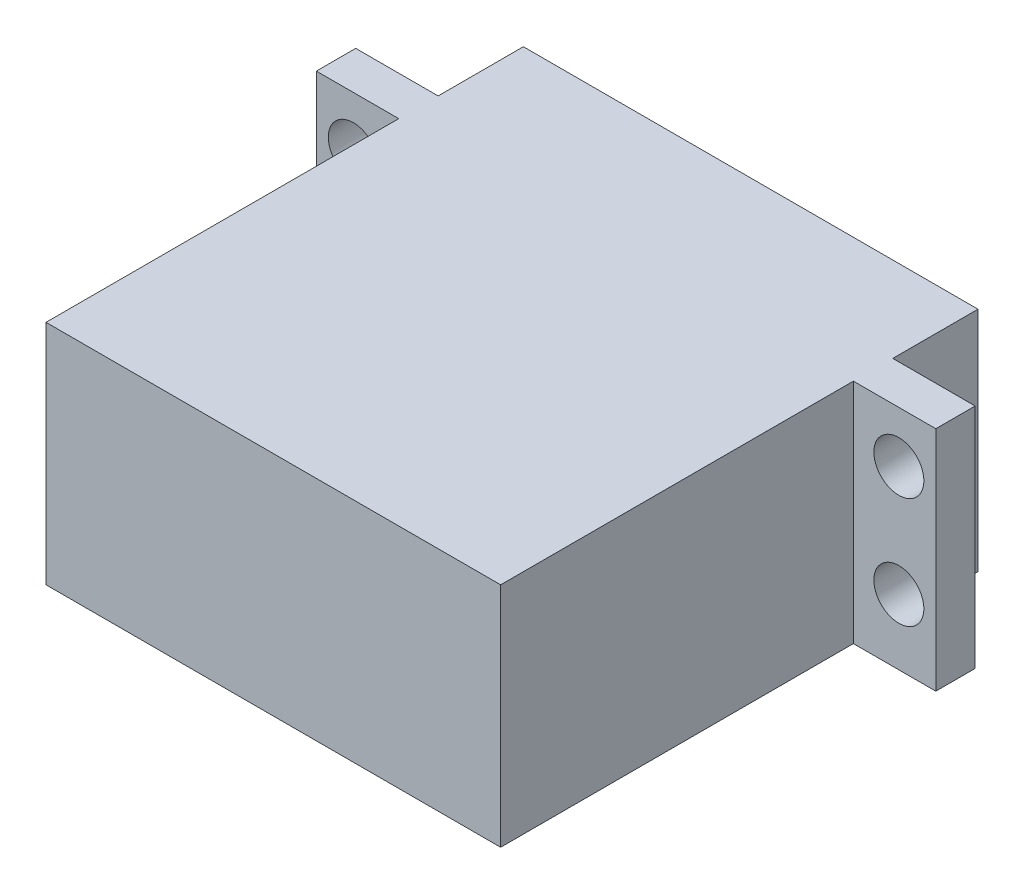
ISO-10303-21;
HEADER;
FILE_DESCRIPTION(('STEP AP214'),'2;1');
FILE_NAME('part.step','',(''),(''),'','','');
FILE_SCHEMA(('AUTOMOTIVE_DESIGN { 1 0 10303 214 1 1 1 1 }'));
ENDSEC;
DATA;
#1=APPLICATION_CONTEXT('core data for automotive mechanical design processes');
#2=APPLICATION_PROTOCOL_DEFINITION('international standard','automotive_design',2000,#1);
#3=PRODUCT_CONTEXT('',#1,'mechanical');
#4=PRODUCT('Part','Part','',(#3));
#5=PRODUCT_RELATED_PRODUCT_CATEGORY('part','',(#4));
#6=PRODUCT_DEFINITION_FORMATION('','',#4);
#7=PRODUCT_DEFINITION_CONTEXT('part definition',#1,'design');
#8=PRODUCT_DEFINITION('design','',#6,#7);
#9=PRODUCT_DEFINITION_SHAPE('','',#8);
#10=(LENGTH_UNIT() NAMED_UNIT(*) SI_UNIT(.MILLI.,.METRE.));
#11=(NAMED_UNIT(*) PLANE_ANGLE_UNIT() SI_UNIT($,.RADIAN.));
#12=(NAMED_UNIT(*) SI_UNIT($,.STERADIAN.) SOLID_ANGLE_UNIT());
#13=UNCERTAINTY_MEASURE_WITH_UNIT(LENGTH_MEASURE(1.E-05),#10,'distance_accuracy_value','');
#14=(GEOMETRIC_REPRESENTATION_CONTEXT(3) GLOBAL_UNCERTAINTY_ASSIGNED_CONTEXT((#13)) GLOBAL_UNIT_ASSIGNED_CONTEXT((#10,
#11,#12)) REPRESENTATION_CONTEXT('',''));
#15=CARTESIAN_POINT('',(0.,0.,0.));
#16=DIRECTION('',(0.,0.,1.));
#17=DIRECTION('',(1.,0.,0.));
#18=AXIS2_PLACEMENT_3D('',#15,#16,#17);
#19=CARTESIAN_POINT('',(-20.,20.,-21.));
#20=DIRECTION('',(1.,0.,0.));
#21=DIRECTION('',(0.,0.,-1.));
#22=AXIS2_PLACEMENT_3D('',#19,#20,#21);
#23=PLANE('',#22);
#24=DIRECTION('',(0.,0.,1.));
#25=VECTOR('',#24,1.);
#26=CARTESIAN_POINT('',(-20.,20.,-21.));
#27=LINE('',#26,#25);
#28=CARTESIAN_POINT('',(-20.,20.,-10.0367099661439));
#29=VERTEX_POINT('',#28);
#30=CARTESIAN_POINT('',(-20.,20.,21.));
#31=VERTEX_POINT('',#30);
#32=EDGE_CURVE('E207',#29,#31,#27,.T.);
#33=ORIENTED_EDGE('',*,*,#32,.F.);
#34=DIRECTION('',(0.,-1.,0.));
#35=VECTOR('',#34,1.);
#36=CARTESIAN_POINT('',(-20.,20.,-10.0367099661439));
#37=LINE('',#36,#35);
#38=CARTESIAN_POINT('',(-20.,0.,-10.0367099661439));
#39=VERTEX_POINT('',#38);
#40=EDGE_CURVE('E134',#29,#39,#37,.T.);
#41=ORIENTED_EDGE('',*,*,#40,.T.);
#42=DIRECTION('',(0.,0.,1.));
#43=VECTOR('',#42,1.);
#44=CARTESIAN_POINT('',(-20.,0.,-21.));
#45=LINE('',#44,#43);
#46=CARTESIAN_POINT('',(-20.,0.,21.));
#47=VERTEX_POINT('',#46);
#48=EDGE_CURVE('E217',#39,#47,#45,.T.);
#49=ORIENTED_EDGE('',*,*,#48,.T.);
#50=DIRECTION('',(0.,-1.,0.));
#51=VECTOR('',#50,1.);
#52=CARTESIAN_POINT('',(-20.,20.,21.));
#53=LINE('',#52,#51);
#54=EDGE_CURVE('E225',#31,#47,#53,.T.);
#55=ORIENTED_EDGE('',*,*,#54,.F.);
#56=EDGE_LOOP('',(#33,#41,#49,#55));
#57=FACE_BOUND('',#56,.T.);
#58=ADVANCED_FACE('F37',(#57),#23,.F.);
#59=CARTESIAN_POINT('',(20.,20.,-21.));
#60=DIRECTION('',(-1.,0.,0.));
#61=DIRECTION('',(0.,0.,1.));
#62=AXIS2_PLACEMENT_3D('',#59,#60,#61);
#63=PLANE('',#62);
#64=DIRECTION('',(0.,-1.,0.));
#65=VECTOR('',#64,1.);
#66=CARTESIAN_POINT('',(20.,20.,-10.0367099661439));
#67=LINE('',#66,#65);
#68=CARTESIAN_POINT('',(20.,20.,-10.0367099661439));
#69=VERTEX_POINT('',#68);
#70=CARTESIAN_POINT('',(20.,0.,-10.0367099661439));
#71=VERTEX_POINT('',#70);
#72=EDGE_CURVE('E60',#69,#71,#67,.T.);
#73=ORIENTED_EDGE('',*,*,#72,.F.);
#74=DIRECTION('',(0.,0.,-1.));
#75=VECTOR('',#74,1.);
#76=CARTESIAN_POINT('',(20.,20.,-21.));
#77=LINE('',#76,#75);
#78=CARTESIAN_POINT('',(20.,20.,21.));
#79=VERTEX_POINT('',#78);
#80=EDGE_CURVE('E202',#79,#69,#77,.T.);
#81=ORIENTED_EDGE('',*,*,#80,.F.);
#82=DIRECTION('',(0.,-1.,0.));
#83=VECTOR('',#82,1.);
#84=CARTESIAN_POINT('',(20.,20.,21.));
#85=LINE('',#84,#83);
#86=CARTESIAN_POINT('',(20.,0.,21.));
#87=VERTEX_POINT('',#86);
#88=EDGE_CURVE('E212',#79,#87,#85,.T.);
#89=ORIENTED_EDGE('',*,*,#88,.T.);
#90=DIRECTION('',(0.,0.,-1.));
#91=VECTOR('',#90,1.);
#92=CARTESIAN_POINT('',(20.,0.,-21.));
#93=LINE('',#92,#91);
#94=EDGE_CURVE('E213',#87,#71,#93,.T.);
#95=ORIENTED_EDGE('',*,*,#94,.T.);
#96=EDGE_LOOP('',(#73,#81,#89,#95));
#97=FACE_BOUND('',#96,.T.);
#98=ADVANCED_FACE('F39',(#97),#63,.F.);
#99=DIRECTION('',(0.,1.,0.));
#100=VECTOR('',#99,1.);
#101=CARTESIAN_POINT('',(20.,20.,-13.5));
#102=LINE('',#101,#100);
#103=CARTESIAN_POINT('',(20.,0.,-13.5));
#104=VERTEX_POINT('',#103);
#105=CARTESIAN_POINT('',(20.,20.,-13.5));
#106=VERTEX_POINT('',#105);
#107=EDGE_CURVE('E180',#104,#106,#102,.T.);
#108=ORIENTED_EDGE('',*,*,#107,.F.);
#109=CARTESIAN_POINT('',(20.,0.,-21.));
#110=VERTEX_POINT('',#109);
#111=EDGE_CURVE('E201',#104,#110,#93,.T.);
#112=ORIENTED_EDGE('',*,*,#111,.T.);
#113=DIRECTION('',(0.,-1.,0.));
#114=VECTOR('',#113,1.);
#115=CARTESIAN_POINT('',(20.,20.,-21.));
#116=LINE('',#115,#114);
#117=CARTESIAN_POINT('',(20.,20.,-21.));
#118=VERTEX_POINT('',#117);
#119=EDGE_CURVE('E45',#118,#110,#116,.T.);
#120=ORIENTED_EDGE('',*,*,#119,.F.);
#121=EDGE_CURVE('E205',#106,#118,#77,.T.);
#122=ORIENTED_EDGE('',*,*,#121,.F.);
#123=EDGE_LOOP('',(#108,#112,#120,#122));
#124=FACE_BOUND('',#123,.T.);
#125=ADVANCED_FACE('F238',(#124),#63,.F.);
#126=CARTESIAN_POINT('',(-20.,20.,-21.));
#127=DIRECTION('',(0.,0.,1.));
#128=DIRECTION('',(1.,0.,0.));
#129=AXIS2_PLACEMENT_3D('',#126,#127,#128);
#130=PLANE('',#129);
#131=CARTESIAN_POINT('',(-10.,10.,-21.));
#132=DIRECTION('',(0.,0.,1.));
#133=DIRECTION('',(1.,0.,0.));
#134=AXIS2_PLACEMENT_3D('',#131,#132,#133);
#135=CIRCLE('',#134,3.);
#136=CARTESIAN_POINT('',(-7.,10.,-21.));
#137=VERTEX_POINT('',#136);
#138=EDGE_CURVE('E11',#137,#137,#135,.F.);
#139=ORIENTED_EDGE('',*,*,#138,.F.);
#140=EDGE_LOOP('',(#139));
#141=FACE_BOUND('',#140,.T.);
#142=DIRECTION('',(-1.,0.,0.));
#143=VECTOR('',#142,1.);
#144=CARTESIAN_POINT('',(-20.,0.,-21.));
#145=LINE('',#144,#143);
#146=CARTESIAN_POINT('',(-20.,0.,-21.));
#147=VERTEX_POINT('',#146);
#148=EDGE_CURVE('E215',#110,#147,#145,.T.);
#149=ORIENTED_EDGE('',*,*,#148,.T.);
#150=DIRECTION('',(0.,-1.,0.));
#151=VECTOR('',#150,1.);
#152=CARTESIAN_POINT('',(-20.,20.,-21.));
#153=LINE('',#152,#151);
#154=CARTESIAN_POINT('',(-20.,20.,-21.));
#155=VERTEX_POINT('',#154);
#156=EDGE_CURVE('E228',#155,#147,#153,.T.);
#157=ORIENTED_EDGE('',*,*,#156,.F.);
#158=DIRECTION('',(-1.,0.,0.));
#159=VECTOR('',#158,1.);
#160=CARTESIAN_POINT('',(-20.,20.,-21.));
#161=LINE('',#160,#159);
#162=EDGE_CURVE('E204',#118,#155,#161,.T.);
#163=ORIENTED_EDGE('',*,*,#162,.F.);
#164=ORIENTED_EDGE('',*,*,#119,.T.);
#165=EDGE_LOOP('',(#149,#157,#163,#164));
#166=FACE_BOUND('',#165,.T.);
#167=ADVANCED_FACE('F234',(#141,#166),#130,.F.);
#168=CARTESIAN_POINT('',(-20.,0.,-13.5));
#169=VERTEX_POINT('',#168);
#170=EDGE_CURVE('E218',#147,#169,#45,.T.);
#171=ORIENTED_EDGE('',*,*,#170,.T.);
#172=DIRECTION('',(0.,1.,0.));
#173=VECTOR('',#172,1.);
#174=CARTESIAN_POINT('',(-20.,20.,-13.5));
#175=LINE('',#174,#173);
#176=CARTESIAN_POINT('',(-20.,20.,-13.5));
#177=VERTEX_POINT('',#176);
#178=EDGE_CURVE('E147',#169,#177,#175,.T.);
#179=ORIENTED_EDGE('',*,*,#178,.T.);
#180=EDGE_CURVE('E208',#155,#177,#27,.T.);
#181=ORIENTED_EDGE('',*,*,#180,.F.);
#182=ORIENTED_EDGE('',*,*,#156,.T.);
#183=EDGE_LOOP('',(#171,#179,#181,#182));
#184=FACE_BOUND('',#183,.T.);
#185=ADVANCED_FACE('F246',(#184),#23,.F.);
#186=CARTESIAN_POINT('',(-20.,20.,21.));
#187=DIRECTION('',(0.,0.,-1.));
#188=DIRECTION('',(-1.,0.,0.));
#189=AXIS2_PLACEMENT_3D('',#186,#187,#188);
#190=PLANE('',#189);
#191=DIRECTION('',(1.,0.,0.));
#192=VECTOR('',#191,1.);
#193=CARTESIAN_POINT('',(-20.,0.,21.));
#194=LINE('',#193,#192);
#195=EDGE_CURVE('E221',#47,#87,#194,.T.);
#196=ORIENTED_EDGE('',*,*,#195,.T.);
#197=ORIENTED_EDGE('',*,*,#88,.F.);
#198=DIRECTION('',(1.,0.,0.));
#199=VECTOR('',#198,1.);
#200=CARTESIAN_POINT('',(-20.,20.,21.));
#201=LINE('',#200,#199);
#202=EDGE_CURVE('E210',#31,#79,#201,.T.);
#203=ORIENTED_EDGE('',*,*,#202,.F.);
#204=ORIENTED_EDGE('',*,*,#54,.T.);
#205=EDGE_LOOP('',(#196,#197,#203,#204));
#206=FACE_BOUND('',#205,.T.);
#207=ADVANCED_FACE('F265',(#206),#190,.F.);
#208=CARTESIAN_POINT('',(0.,20.,0.));
#209=DIRECTION('',(0.,1.,0.));
#210=DIRECTION('',(0.,0.,1.));
#211=AXIS2_PLACEMENT_3D('',#208,#209,#210);
#212=PLANE('',#211);
#213=ORIENTED_EDGE('',*,*,#80,.T.);
#214=DIRECTION('',(-1.,0.,0.));
#215=VECTOR('',#214,1.);
#216=CARTESIAN_POINT('',(27.25,20.,-10.0367099661439));
#217=LINE('',#216,#215);
#218=CARTESIAN_POINT('',(27.25,20.,-10.0367099661439));
#219=VERTEX_POINT('',#218);
#220=EDGE_CURVE('E186',#219,#69,#217,.T.);
#221=ORIENTED_EDGE('',*,*,#220,.F.);
#222=DIRECTION('',(0.,0.,1.));
#223=VECTOR('',#222,1.);
#224=CARTESIAN_POINT('',(27.25,20.,-10.0367099661439));
#225=LINE('',#224,#223);
#226=CARTESIAN_POINT('',(27.25,20.,-13.5));
#227=VERTEX_POINT('',#226);
#228=EDGE_CURVE('E184',#227,#219,#225,.T.);
#229=ORIENTED_EDGE('',*,*,#228,.F.);
#230=DIRECTION('',(-1.,0.,0.));
#231=VECTOR('',#230,1.);
#232=CARTESIAN_POINT('',(27.25,20.,-13.5));
#233=LINE('',#232,#231);
#234=EDGE_CURVE('E192',#227,#106,#233,.T.);
#235=ORIENTED_EDGE('',*,*,#234,.T.);
#236=ORIENTED_EDGE('',*,*,#121,.T.);
#237=ORIENTED_EDGE('',*,*,#162,.T.);
#238=ORIENTED_EDGE('',*,*,#180,.T.);
#239=DIRECTION('',(1.,0.,0.));
#240=VECTOR('',#239,1.);
#241=CARTESIAN_POINT('',(-27.25,20.,-13.5));
#242=LINE('',#241,#240);
#243=CARTESIAN_POINT('',(-27.25,20.,-13.5));
#244=VERTEX_POINT('',#243);
#245=EDGE_CURVE('E52',#244,#177,#242,.T.);
#246=ORIENTED_EDGE('',*,*,#245,.F.);
#247=DIRECTION('',(0.,0.,1.));
#248=VECTOR('',#247,1.);
#249=CARTESIAN_POINT('',(-27.25,20.,-10.0367099661439));
#250=LINE('',#249,#248);
#251=CARTESIAN_POINT('',(-27.25,20.,-10.0367099661439));
#252=VERTEX_POINT('',#251);
#253=EDGE_CURVE('E144',#244,#252,#250,.T.);
#254=ORIENTED_EDGE('',*,*,#253,.T.);
#255=DIRECTION('',(1.,0.,0.));
#256=VECTOR('',#255,1.);
#257=CARTESIAN_POINT('',(-27.25,20.,-10.0367099661439));
#258=LINE('',#257,#256);
#259=EDGE_CURVE('E128',#252,#29,#258,.T.);
#260=ORIENTED_EDGE('',*,*,#259,.T.);
#261=ORIENTED_EDGE('',*,*,#32,.T.);
#262=ORIENTED_EDGE('',*,*,#202,.T.);
#263=EDGE_LOOP('',(#213,#221,#229,#235,#236,#237,#238,#246,#254,#260,#261,#262));
#264=FACE_BOUND('',#263,.T.);
#265=ADVANCED_FACE('F149',(#264),#212,.T.);
#266=CARTESIAN_POINT('',(0.,0.,0.));
#267=DIRECTION('',(0.,1.,0.));
#268=DIRECTION('',(0.,0.,1.));
#269=AXIS2_PLACEMENT_3D('',#266,#267,#268);
#270=PLANE('',#269);
#271=ORIENTED_EDGE('',*,*,#94,.F.);
#272=ORIENTED_EDGE('',*,*,#195,.F.);
#273=ORIENTED_EDGE('',*,*,#48,.F.);
#274=DIRECTION('',(1.,0.,0.));
#275=VECTOR('',#274,1.);
#276=CARTESIAN_POINT('',(-27.25,0.,-10.0367099661439));
#277=LINE('',#276,#275);
#278=CARTESIAN_POINT('',(-27.25,0.,-10.0367099661439));
#279=VERTEX_POINT('',#278);
#280=EDGE_CURVE('E157',#279,#39,#277,.T.);
#281=ORIENTED_EDGE('',*,*,#280,.F.);
#282=DIRECTION('',(0.,0.,-1.));
#283=VECTOR('',#282,1.);
#284=CARTESIAN_POINT('',(-27.25,0.,-10.0367099661439));
#285=LINE('',#284,#283);
#286=CARTESIAN_POINT('',(-27.25,0.,-13.5));
#287=VERTEX_POINT('',#286);
#288=EDGE_CURVE('E146',#279,#287,#285,.T.);
#289=ORIENTED_EDGE('',*,*,#288,.T.);
#290=DIRECTION('',(1.,0.,0.));
#291=VECTOR('',#290,1.);
#292=CARTESIAN_POINT('',(-27.25,0.,-13.5));
#293=LINE('',#292,#291);
#294=EDGE_CURVE('E162',#287,#169,#293,.T.);
#295=ORIENTED_EDGE('',*,*,#294,.T.);
#296=ORIENTED_EDGE('',*,*,#170,.F.);
#297=ORIENTED_EDGE('',*,*,#148,.F.);
#298=ORIENTED_EDGE('',*,*,#111,.F.);
#299=DIRECTION('',(-1.,0.,0.));
#300=VECTOR('',#299,1.);
#301=CARTESIAN_POINT('',(27.25,0.,-13.5));
#302=LINE('',#301,#300);
#303=CARTESIAN_POINT('',(27.25,0.,-13.5));
#304=VERTEX_POINT('',#303);
#305=EDGE_CURVE('E195',#304,#104,#302,.T.);
#306=ORIENTED_EDGE('',*,*,#305,.F.);
#307=DIRECTION('',(0.,0.,-1.));
#308=VECTOR('',#307,1.);
#309=CARTESIAN_POINT('',(27.25,0.,-10.0367099661439));
#310=LINE('',#309,#308);
#311=CARTESIAN_POINT('',(27.25,0.,-10.0367099661439));
#312=VERTEX_POINT('',#311);
#313=EDGE_CURVE('E179',#312,#304,#310,.T.);
#314=ORIENTED_EDGE('',*,*,#313,.F.);
#315=DIRECTION('',(-1.,0.,0.));
#316=VECTOR('',#315,1.);
#317=CARTESIAN_POINT('',(27.25,0.,-10.0367099661439));
#318=LINE('',#317,#316);
#319=EDGE_CURVE('E198',#312,#71,#318,.T.);
#320=ORIENTED_EDGE('',*,*,#319,.T.);
#321=EDGE_LOOP('',(#271,#272,#273,#281,#289,#295,#296,#297,#298,#306,#314,#320));
#322=FACE_BOUND('',#321,.T.);
#323=ADVANCED_FACE('F244',(#322),#270,.F.);
#324=CARTESIAN_POINT('',(27.25,20.,-10.0367099661439));
#325=DIRECTION('',(0.,0.,-1.));
#326=DIRECTION('',(0.,1.,0.));
#327=AXIS2_PLACEMENT_3D('',#324,#325,#326);
#328=PLANE('',#327);
#329=CARTESIAN_POINT('',(24.,15.5,-10.0367099661439));
#330=DIRECTION('',(0.,0.,-1.));
#331=DIRECTION('',(0.,1.,0.));
#332=AXIS2_PLACEMENT_3D('',#329,#330,#331);
#333=CIRCLE('',#332,2.2);
#334=CARTESIAN_POINT('',(21.8,15.5,-10.0367099661439));
#335=VERTEX_POINT('',#334);
#336=EDGE_CURVE('E173',#335,#335,#333,.T.);
#337=ORIENTED_EDGE('',*,*,#336,.T.);
#338=EDGE_LOOP('',(#337));
#339=FACE_BOUND('',#338,.T.);
#340=CARTESIAN_POINT('',(24.,5.75,-10.0367099661439));
#341=DIRECTION('',(0.,0.,-1.));
#342=DIRECTION('',(0.,1.,0.));
#343=AXIS2_PLACEMENT_3D('',#340,#341,#342);
#344=CIRCLE('',#343,2.2);
#345=CARTESIAN_POINT('',(21.8,5.75,-10.0367099661439));
#346=VERTEX_POINT('',#345);
#347=EDGE_CURVE('E168',#346,#346,#344,.T.);
#348=ORIENTED_EDGE('',*,*,#347,.T.);
#349=EDGE_LOOP('',(#348));
#350=FACE_BOUND('',#349,.T.);
#351=ORIENTED_EDGE('',*,*,#72,.T.);
#352=ORIENTED_EDGE('',*,*,#319,.F.);
#353=DIRECTION('',(0.,-1.,0.));
#354=VECTOR('',#353,1.);
#355=CARTESIAN_POINT('',(27.25,20.,-10.0367099661439));
#356=LINE('',#355,#354);
#357=EDGE_CURVE('E176',#219,#312,#356,.T.);
#358=ORIENTED_EDGE('',*,*,#357,.F.);
#359=ORIENTED_EDGE('',*,*,#220,.T.);
#360=EDGE_LOOP('',(#351,#352,#358,#359));
#361=FACE_BOUND('',#360,.T.);
#362=ADVANCED_FACE('F259',(#339,#350,#361),#328,.F.);
#363=CARTESIAN_POINT('',(27.25,20.,-13.5));
#364=DIRECTION('',(0.,0.,1.));
#365=DIRECTION('',(1.,0.,0.));
#366=AXIS2_PLACEMENT_3D('',#363,#364,#365);
#367=PLANE('',#366);
#368=CARTESIAN_POINT('',(24.,15.5,-13.5));
#369=DIRECTION('',(0.,0.,-1.));
#370=DIRECTION('',(-1.,0.,0.));
#371=AXIS2_PLACEMENT_3D('',#368,#369,#370);
#372=CIRCLE('',#371,2.2);
#373=CARTESIAN_POINT('',(21.8,15.5,-13.5));
#374=VERTEX_POINT('',#373);
#375=EDGE_CURVE('E165',#374,#374,#372,.T.);
#376=ORIENTED_EDGE('',*,*,#375,.F.);
#377=EDGE_LOOP('',(#376));
#378=FACE_BOUND('',#377,.T.);
#379=CARTESIAN_POINT('',(24.,5.75,-13.5));
#380=DIRECTION('',(0.,0.,-1.));
#381=DIRECTION('',(-1.,0.,0.));
#382=AXIS2_PLACEMENT_3D('',#379,#380,#381);
#383=CIRCLE('',#382,2.2);
#384=CARTESIAN_POINT('',(21.8,5.75,-13.5));
#385=VERTEX_POINT('',#384);
#386=EDGE_CURVE('E138',#385,#385,#383,.T.);
#387=ORIENTED_EDGE('',*,*,#386,.F.);
#388=EDGE_LOOP('',(#387));
#389=FACE_BOUND('',#388,.T.);
#390=ORIENTED_EDGE('',*,*,#107,.T.);
#391=ORIENTED_EDGE('',*,*,#234,.F.);
#392=DIRECTION('',(0.,1.,0.));
#393=VECTOR('',#392,1.);
#394=CARTESIAN_POINT('',(27.25,20.,-13.5));
#395=LINE('',#394,#393);
#396=EDGE_CURVE('E182',#304,#227,#395,.T.);
#397=ORIENTED_EDGE('',*,*,#396,.F.);
#398=ORIENTED_EDGE('',*,*,#305,.T.);
#399=EDGE_LOOP('',(#390,#391,#397,#398));
#400=FACE_BOUND('',#399,.T.);
#401=ADVANCED_FACE('F253',(#378,#389,#400),#367,.F.);
#402=CARTESIAN_POINT('',(27.25,0.,0.));
#403=DIRECTION('',(1.,0.,0.));
#404=DIRECTION('',(0.,0.,-1.));
#405=AXIS2_PLACEMENT_3D('',#402,#403,#404);
#406=PLANE('',#405);
#407=ORIENTED_EDGE('',*,*,#357,.T.);
#408=ORIENTED_EDGE('',*,*,#313,.T.);
#409=ORIENTED_EDGE('',*,*,#396,.T.);
#410=ORIENTED_EDGE('',*,*,#228,.T.);
#411=EDGE_LOOP('',(#407,#408,#409,#410));
#412=FACE_BOUND('',#411,.T.);
#413=ADVANCED_FACE('F257',(#412),#406,.T.);
#414=CARTESIAN_POINT('',(24.,5.75,-6.25));
#415=DIRECTION('',(0.,0.,-1.));
#416=DIRECTION('',(-1.,0.,0.));
#417=AXIS2_PLACEMENT_3D('',#414,#415,#416);
#418=CYLINDRICAL_SURFACE('',#417,2.2);
#419=CARTESIAN_POINT('',(21.8,5.75,-13.5));
#420=CARTESIAN_POINT('',(21.8,5.75,-13.4639240621473));
#421=CARTESIAN_POINT('',(21.8,5.75,-13.4278481242947));
#422=CARTESIAN_POINT('',(21.8,5.75,-13.3556962485893));
#423=CARTESIAN_POINT('',(21.8,5.75,-13.3196203107367));
#424=CARTESIAN_POINT('',(21.8,5.75,-13.2474684350313));
#425=CARTESIAN_POINT('',(21.8,5.75,-13.2113924971787));
#426=CARTESIAN_POINT('',(21.8,5.75,-13.1392406214733));
#427=CARTESIAN_POINT('',(21.8,5.75,-13.1031646836207));
#428=CARTESIAN_POINT('',(21.8,5.75,-13.0310128079153));
#429=CARTESIAN_POINT('',(21.8,5.75,-12.9949368700627));
#430=CARTESIAN_POINT('',(21.8,5.75,-12.9227849943573));
#431=CARTESIAN_POINT('',(21.8,5.75,-12.8867090565047));
#432=CARTESIAN_POINT('',(21.8,5.75,-12.8145571807993));
#433=CARTESIAN_POINT('',(21.8,5.75,-12.7784812429467));
#434=CARTESIAN_POINT('',(21.8,5.75,-12.7063293672413));
#435=CARTESIAN_POINT('',(21.8,5.75,-12.6702534293887));
#436=CARTESIAN_POINT('',(21.8,5.75,-12.5981015536833));
#437=CARTESIAN_POINT('',(21.8,5.75,-12.5620256158306));
#438=CARTESIAN_POINT('',(21.8,5.75,-12.4898737401253));
#439=CARTESIAN_POINT('',(21.8,5.75,-12.4537978022726));
#440=CARTESIAN_POINT('',(21.8,5.75,-12.3816459265673));
#441=CARTESIAN_POINT('',(21.8,5.75,-12.3455699887146));
#442=CARTESIAN_POINT('',(21.8,5.75,-12.2734181130093));
#443=CARTESIAN_POINT('',(21.8,5.75,-12.2373421751566));
#444=CARTESIAN_POINT('',(21.8,5.75,-12.1651902994513));
#445=CARTESIAN_POINT('',(21.8,5.75,-12.1291143615986));
#446=CARTESIAN_POINT('',(21.8,5.75,-12.0569624858933));
#447=CARTESIAN_POINT('',(21.8,5.75,-12.0208865480406));
#448=CARTESIAN_POINT('',(21.8,5.75,-11.9487346723353));
#449=CARTESIAN_POINT('',(21.8,5.75,-11.9126587344826));
#450=CARTESIAN_POINT('',(21.8,5.75,-11.8405068587773));
#451=CARTESIAN_POINT('',(21.8,5.75,-11.8044309209246));
#452=CARTESIAN_POINT('',(21.8,5.75,-11.7322790452193));
#453=CARTESIAN_POINT('',(21.8,5.75,-11.6962031073666));
#454=CARTESIAN_POINT('',(21.8,5.75,-11.6240512316613));
#455=CARTESIAN_POINT('',(21.8,5.75,-11.5879752938086));
#456=CARTESIAN_POINT('',(21.8,5.75,-11.5158234181033));
#457=CARTESIAN_POINT('',(21.8,5.75,-11.4797474802506));
#458=CARTESIAN_POINT('',(21.8,5.75,-11.4075956045453));
#459=CARTESIAN_POINT('',(21.8,5.75,-11.3715196666926));
#460=CARTESIAN_POINT('',(21.8,5.75,-11.2993677909873));
#461=CARTESIAN_POINT('',(21.8,5.75,-11.2632918531346));
#462=CARTESIAN_POINT('',(21.8,5.75,-11.1911399774293));
#463=CARTESIAN_POINT('',(21.8,5.75,-11.1550640395766));
#464=CARTESIAN_POINT('',(21.8,5.75,-11.0829121638713));
#465=CARTESIAN_POINT('',(21.8,5.75,-11.0468362260186));
#466=CARTESIAN_POINT('',(21.8,5.75,-10.9746843503133));
#467=CARTESIAN_POINT('',(21.8,5.75,-10.9386084124606));
#468=CARTESIAN_POINT('',(21.8,5.75,-10.8664565367553));
#469=CARTESIAN_POINT('',(21.8,5.75,-10.8303805989026));
#470=CARTESIAN_POINT('',(21.8,5.75,-10.7582287231973));
#471=CARTESIAN_POINT('',(21.8,5.75,-10.7221527853446));
#472=CARTESIAN_POINT('',(21.8,5.75,-10.6500009096393));
#473=CARTESIAN_POINT('',(21.8,5.75,-10.6139249717866));
#474=CARTESIAN_POINT('',(21.8,5.75,-10.5417730960813));
#475=CARTESIAN_POINT('',(21.8,5.75,-10.5056971582286));
#476=CARTESIAN_POINT('',(21.8,5.75,-10.4335452825233));
#477=CARTESIAN_POINT('',(21.8,5.75,-10.3974693446706));
#478=CARTESIAN_POINT('',(21.8,5.75,-10.3253174689653));
#479=CARTESIAN_POINT('',(21.8,5.75,-10.2892415311126));
#480=CARTESIAN_POINT('',(21.8,5.75,-10.2170896554073));
#481=CARTESIAN_POINT('',(21.8,5.75,-10.1810137175546));
#482=CARTESIAN_POINT('',(21.8,5.75,-10.1088618418493));
#483=CARTESIAN_POINT('',(21.8,5.75,-10.0727859039966));
#484=CARTESIAN_POINT('',(21.8,5.75,-10.0367099661439));
#485=B_SPLINE_CURVE_WITH_KNOTS('',3,(#419,#420,#421,#422,#423,#424,#425,#426,#427,#428,#429,
#430,#431,#432,#433,#434,#435,#436,#437,#438,#439,#440,#441,#442,#443,#444,#445,#446,#447,#448,
#449,#450,#451,#452,#453,#454,#455,#456,#457,#458,#459,#460,#461,#462,#463,#464,#465,#466,#467,
#468,#469,#470,#471,#472,#473,#474,#475,#476,#477,#478,#479,#480,#481,#482,#483,#484),
.UNSPECIFIED.,.F.,.F.,(4,2,2,2,2,2,2,2,2,2,2,2,2,2,2,2,2,2,2,2,2,2,2,2,2,2,2,2,2,2,2,2,4),(0.,
0.108227813558003,0.216455627116004,0.324683440674005,0.432911254232008,0.541139067790011,
0.649366881348012,0.757594694906013,0.865822508464016,0.974050322022019,1.08227813558002,
1.19050594913802,1.29873376269602,1.40696157625403,1.51518938981203,1.62341720337003,
1.73164501692803,1.83987283048604,1.94810064404404,2.05632845760204,2.16455627116004,
2.27278408471804,2.38101189827604,2.48923971183405,2.59746752539205,2.70569533895005,
2.81392315250805,2.92215096606606,3.03037877962406,3.13860659318206,3.24683440674006,
3.35506222029806,3.46329003385606),.UNSPECIFIED.);
#486=EDGE_CURVE('BSEAM319',#385,#346,#485,.T.);
#487=ORIENTED_EDGE('',*,*,#386,.T.);
#488=ORIENTED_EDGE('',*,*,#347,.F.);
#489=ORIENTED_EDGE('',*,*,#486,.T.);
#490=ORIENTED_EDGE('',*,*,#486,.F.);
#491=EDGE_LOOP('',(#487,#489,#488,#490));
#492=FACE_BOUND('',#491,.T.);
#493=ADVANCED_FACE('F319',(#492),#418,.F.);
#494=CARTESIAN_POINT('',(24.,15.5,-6.25));
#495=DIRECTION('',(0.,0.,-1.));
#496=DIRECTION('',(-1.,0.,0.));
#497=AXIS2_PLACEMENT_3D('',#494,#495,#496);
#498=CYLINDRICAL_SURFACE('',#497,2.2);
#499=CARTESIAN_POINT('',(21.8,15.5,-13.5));
#500=CARTESIAN_POINT('',(21.8,15.5,-13.4639240621473));
#501=CARTESIAN_POINT('',(21.8,15.5,-13.4278481242947));
#502=CARTESIAN_POINT('',(21.8,15.5,-13.3556962485893));
#503=CARTESIAN_POINT('',(21.8,15.5,-13.3196203107367));
#504=CARTESIAN_POINT('',(21.8,15.5,-13.2474684350313));
#505=CARTESIAN_POINT('',(21.8,15.5,-13.2113924971787));
#506=CARTESIAN_POINT('',(21.8,15.5,-13.1392406214733));
#507=CARTESIAN_POINT('',(21.8,15.5,-13.1031646836207));
#508=CARTESIAN_POINT('',(21.8,15.5,-13.0310128079153));
#509=CARTESIAN_POINT('',(21.8,15.5,-12.9949368700627));
#510=CARTESIAN_POINT('',(21.8,15.5,-12.9227849943573));
#511=CARTESIAN_POINT('',(21.8,15.5,-12.8867090565047));
#512=CARTESIAN_POINT('',(21.8,15.5,-12.8145571807993));
#513=CARTESIAN_POINT('',(21.8,15.5,-12.7784812429467));
#514=CARTESIAN_POINT('',(21.8,15.5,-12.7063293672413));
#515=CARTESIAN_POINT('',(21.8,15.5,-12.6702534293886));
#516=CARTESIAN_POINT('',(21.8,15.5,-12.5981015536833));
#517=CARTESIAN_POINT('',(21.8,15.5,-12.5620256158306));
#518=CARTESIAN_POINT('',(21.8,15.5,-12.4898737401253));
#519=CARTESIAN_POINT('',(21.8,15.5,-12.4537978022726));
#520=CARTESIAN_POINT('',(21.8,15.5,-12.3816459265673));
#521=CARTESIAN_POINT('',(21.8,15.5,-12.3455699887146));
#522=CARTESIAN_POINT('',(21.8,15.5,-12.2734181130093));
#523=CARTESIAN_POINT('',(21.8,15.5,-12.2373421751566));
#524=CARTESIAN_POINT('',(21.8,15.5,-12.1651902994513));
#525=CARTESIAN_POINT('',(21.8,15.5,-12.1291143615986));
#526=CARTESIAN_POINT('',(21.8,15.5,-12.0569624858933));
#527=CARTESIAN_POINT('',(21.8,15.5,-12.0208865480406));
#528=CARTESIAN_POINT('',(21.8,15.5,-11.9487346723353));
#529=CARTESIAN_POINT('',(21.8,15.5,-11.9126587344826));
#530=CARTESIAN_POINT('',(21.8,15.5,-11.8405068587773));
#531=CARTESIAN_POINT('',(21.8,15.5,-11.8044309209246));
#532=CARTESIAN_POINT('',(21.8,15.5,-11.7322790452193));
#533=CARTESIAN_POINT('',(21.8,15.5,-11.6962031073666));
#534=CARTESIAN_POINT('',(21.8,15.5,-11.6240512316613));
#535=CARTESIAN_POINT('',(21.8,15.5,-11.5879752938086));
#536=CARTESIAN_POINT('',(21.8,15.5,-11.5158234181033));
#537=CARTESIAN_POINT('',(21.8,15.5,-11.4797474802506));
#538=CARTESIAN_POINT('',(21.8,15.5,-11.4075956045453));
#539=CARTESIAN_POINT('',(21.8,15.5,-11.3715196666926));
#540=CARTESIAN_POINT('',(21.8,15.5,-11.2993677909873));
#541=CARTESIAN_POINT('',(21.8,15.5,-11.2632918531346));
#542=CARTESIAN_POINT('',(21.8,15.5,-11.1911399774293));
#543=CARTESIAN_POINT('',(21.8,15.5,-11.1550640395766));
#544=CARTESIAN_POINT('',(21.8,15.5,-11.0829121638713));
#545=CARTESIAN_POINT('',(21.8,15.5,-11.0468362260186));
#546=CARTESIAN_POINT('',(21.8,15.5,-10.9746843503133));
#547=CARTESIAN_POINT('',(21.8,15.5,-10.9386084124606));
#548=CARTESIAN_POINT('',(21.8,15.5,-10.8664565367553));
#549=CARTESIAN_POINT('',(21.8,15.5,-10.8303805989026));
#550=CARTESIAN_POINT('',(21.8,15.5,-10.7582287231973));
#551=CARTESIAN_POINT('',(21.8,15.5,-10.7221527853446));
#552=CARTESIAN_POINT('',(21.8,15.5,-10.6500009096393));
#553=CARTESIAN_POINT('',(21.8,15.5,-10.6139249717866));
#554=CARTESIAN_POINT('',(21.8,15.5,-10.5417730960813));
#555=CARTESIAN_POINT('',(21.8,15.5,-10.5056971582286));
#556=CARTESIAN_POINT('',(21.8,15.5,-10.4335452825233));
#557=CARTESIAN_POINT('',(21.8,15.5,-10.3974693446706));
#558=CARTESIAN_POINT('',(21.8,15.5,-10.3253174689653));
#559=CARTESIAN_POINT('',(21.8,15.5,-10.2892415311126));
#560=CARTESIAN_POINT('',(21.8,15.5,-10.2170896554073));
#561=CARTESIAN_POINT('',(21.8,15.5,-10.1810137175546));
#562=CARTESIAN_POINT('',(21.8,15.5,-10.1088618418493));
#563=CARTESIAN_POINT('',(21.8,15.5,-10.0727859039966));
#564=CARTESIAN_POINT('',(21.8,15.5,-10.0367099661439));
#565=B_SPLINE_CURVE_WITH_KNOTS('',3,(#499,#500,#501,#502,#503,#504,#505,#506,#507,#508,#509,
#510,#511,#512,#513,#514,#515,#516,#517,#518,#519,#520,#521,#522,#523,#524,#525,#526,#527,#528,
#529,#530,#531,#532,#533,#534,#535,#536,#537,#538,#539,#540,#541,#542,#543,#544,#545,#546,#547,
#548,#549,#550,#551,#552,#553,#554,#555,#556,#557,#558,#559,#560,#561,#562,#563,#564),
.UNSPECIFIED.,.F.,.F.,(4,2,2,2,2,2,2,2,2,2,2,2,2,2,2,2,2,2,2,2,2,2,2,2,2,2,2,2,2,2,2,2,4),(0.,
0.108227813558003,0.216455627116004,0.324683440674005,0.432911254232008,0.541139067790011,
0.649366881348012,0.757594694906015,0.865822508464018,0.974050322022019,1.08227813558002,
1.19050594913802,1.29873376269603,1.40696157625403,1.51518938981203,1.62341720337003,
1.73164501692803,1.83987283048604,1.94810064404404,2.05632845760204,2.16455627116004,
2.27278408471805,2.38101189827605,2.48923971183405,2.59746752539205,2.70569533895005,
2.81392315250806,2.92215096606606,3.03037877962406,3.13860659318206,3.24683440674006,
3.35506222029807,3.46329003385607),.UNSPECIFIED.);
#566=EDGE_CURVE('BSEAM315',#374,#335,#565,.T.);
#567=ORIENTED_EDGE('',*,*,#375,.T.);
#568=ORIENTED_EDGE('',*,*,#336,.F.);
#569=ORIENTED_EDGE('',*,*,#566,.T.);
#570=ORIENTED_EDGE('',*,*,#566,.F.);
#571=EDGE_LOOP('',(#567,#569,#568,#570));
#572=FACE_BOUND('',#571,.T.);
#573=ADVANCED_FACE('F315',(#572),#498,.F.);
#574=CARTESIAN_POINT('',(-27.25,20.,-10.0367099661439));
#575=DIRECTION('',(0.,0.,1.));
#576=DIRECTION('',(0.,-1.,0.));
#577=AXIS2_PLACEMENT_3D('',#574,#575,#576);
#578=PLANE('',#577);
#579=CARTESIAN_POINT('',(-24.,15.5,-10.0367099661439));
#580=DIRECTION('',(0.,0.,1.));
#581=DIRECTION('',(0.,-1.,0.));
#582=AXIS2_PLACEMENT_3D('',#579,#580,#581);
#583=CIRCLE('',#582,2.2);
#584=CARTESIAN_POINT('',(-26.2,15.5,-10.0367099661439));
#585=VERTEX_POINT('',#584);
#586=EDGE_CURVE('E159',#585,#585,#583,.F.);
#587=ORIENTED_EDGE('',*,*,#586,.T.);
#588=EDGE_LOOP('',(#587));
#589=FACE_BOUND('',#588,.T.);
#590=CARTESIAN_POINT('',(-24.,5.75,-10.0367099661439));
#591=DIRECTION('',(0.,0.,1.));
#592=DIRECTION('',(0.,-1.,0.));
#593=AXIS2_PLACEMENT_3D('',#590,#591,#592);
#594=CIRCLE('',#593,2.2);
#595=CARTESIAN_POINT('',(-26.2,5.75,-10.0367099661439));
#596=VERTEX_POINT('',#595);
#597=EDGE_CURVE('E432',#596,#596,#594,.F.);
#598=ORIENTED_EDGE('',*,*,#597,.T.);
#599=EDGE_LOOP('',(#598));
#600=FACE_BOUND('',#599,.T.);
#601=ORIENTED_EDGE('',*,*,#40,.F.);
#602=ORIENTED_EDGE('',*,*,#259,.F.);
#603=DIRECTION('',(0.,-1.,0.));
#604=VECTOR('',#603,1.);
#605=CARTESIAN_POINT('',(-27.25,20.,-10.0367099661439));
#606=LINE('',#605,#604);
#607=EDGE_CURVE('E131',#252,#279,#606,.T.);
#608=ORIENTED_EDGE('',*,*,#607,.T.);
#609=ORIENTED_EDGE('',*,*,#280,.T.);
#610=EDGE_LOOP('',(#601,#602,#608,#609));
#611=FACE_BOUND('',#610,.T.);
#612=ADVANCED_FACE('F130',(#589,#600,#611),#578,.T.);
#613=CARTESIAN_POINT('',(-27.25,20.,-13.5));
#614=DIRECTION('',(0.,0.,-1.));
#615=DIRECTION('',(-1.,0.,0.));
#616=AXIS2_PLACEMENT_3D('',#613,#614,#615);
#617=PLANE('',#616);
#618=CARTESIAN_POINT('',(-24.,15.5,-13.5));
#619=DIRECTION('',(0.,0.,1.));
#620=DIRECTION('',(1.,0.,0.));
#621=AXIS2_PLACEMENT_3D('',#618,#619,#620);
#622=CIRCLE('',#621,2.2);
#623=CARTESIAN_POINT('',(-26.2,15.5,-13.5));
#624=VERTEX_POINT('',#623);
#625=EDGE_CURVE('E429',#624,#624,#622,.T.);
#626=ORIENTED_EDGE('',*,*,#625,.T.);
#627=EDGE_LOOP('',(#626));
#628=FACE_BOUND('',#627,.T.);
#629=CARTESIAN_POINT('',(-24.,5.75,-13.5));
#630=DIRECTION('',(0.,0.,1.));
#631=DIRECTION('',(1.,0.,0.));
#632=AXIS2_PLACEMENT_3D('',#629,#630,#631);
#633=CIRCLE('',#632,2.2);
#634=CARTESIAN_POINT('',(-26.2,5.75,-13.5));
#635=VERTEX_POINT('',#634);
#636=EDGE_CURVE('E424',#635,#635,#633,.T.);
#637=ORIENTED_EDGE('',*,*,#636,.T.);
#638=EDGE_LOOP('',(#637));
#639=FACE_BOUND('',#638,.T.);
#640=ORIENTED_EDGE('',*,*,#178,.F.);
#641=ORIENTED_EDGE('',*,*,#294,.F.);
#642=DIRECTION('',(0.,1.,0.));
#643=VECTOR('',#642,1.);
#644=CARTESIAN_POINT('',(-27.25,20.,-13.5));
#645=LINE('',#644,#643);
#646=EDGE_CURVE('E151',#287,#244,#645,.T.);
#647=ORIENTED_EDGE('',*,*,#646,.T.);
#648=ORIENTED_EDGE('',*,*,#245,.T.);
#649=EDGE_LOOP('',(#640,#641,#647,#648));
#650=FACE_BOUND('',#649,.T.);
#651=ADVANCED_FACE('F309',(#628,#639,#650),#617,.T.);
#652=CARTESIAN_POINT('',(-27.25,0.,0.));
#653=DIRECTION('',(-1.,0.,0.));
#654=DIRECTION('',(0.,0.,-1.));
#655=AXIS2_PLACEMENT_3D('',#652,#653,#654);
#656=PLANE('',#655);
#657=ORIENTED_EDGE('',*,*,#607,.F.);
#658=ORIENTED_EDGE('',*,*,#253,.F.);
#659=ORIENTED_EDGE('',*,*,#646,.F.);
#660=ORIENTED_EDGE('',*,*,#288,.F.);
#661=EDGE_LOOP('',(#657,#658,#659,#660));
#662=FACE_BOUND('',#661,.T.);
#663=ADVANCED_FACE('F142',(#662),#656,.T.);
#664=CARTESIAN_POINT('',(-24.,5.75,-6.24999999999999));
#665=DIRECTION('',(0.,0.,-1.));
#666=DIRECTION('',(-1.,0.,0.));
#667=AXIS2_PLACEMENT_3D('',#664,#665,#666);
#668=CYLINDRICAL_SURFACE('',#667,2.2);
#669=CARTESIAN_POINT('',(-26.2,5.75,-10.0367099661439));
#670=CARTESIAN_POINT('',(-26.2,5.75,-10.0727859039966));
#671=CARTESIAN_POINT('',(-26.2,5.75,-10.1088618418493));
#672=CARTESIAN_POINT('',(-26.2,5.75,-10.1810137175546));
#673=CARTESIAN_POINT('',(-26.2,5.75,-10.2170896554073));
#674=CARTESIAN_POINT('',(-26.2,5.75,-10.2892415311126));
#675=CARTESIAN_POINT('',(-26.2,5.75,-10.3253174689653));
#676=CARTESIAN_POINT('',(-26.2,5.75,-10.3974693446706));
#677=CARTESIAN_POINT('',(-26.2,5.75,-10.4335452825233));
#678=CARTESIAN_POINT('',(-26.2,5.75,-10.5056971582286));
#679=CARTESIAN_POINT('',(-26.2,5.75,-10.5417730960813));
#680=CARTESIAN_POINT('',(-26.2,5.75,-10.6139249717866));
#681=CARTESIAN_POINT('',(-26.2,5.75,-10.6500009096393));
#682=CARTESIAN_POINT('',(-26.2,5.75,-10.7221527853446));
#683=CARTESIAN_POINT('',(-26.2,5.75,-10.7582287231973));
#684=CARTESIAN_POINT('',(-26.2,5.75,-10.8303805989026));
#685=CARTESIAN_POINT('',(-26.2,5.75,-10.8664565367553));
#686=CARTESIAN_POINT('',(-26.2,5.75,-10.9386084124606));
#687=CARTESIAN_POINT('',(-26.2,5.75,-10.9746843503133));
#688=CARTESIAN_POINT('',(-26.2,5.75,-11.0468362260186));
#689=CARTESIAN_POINT('',(-26.2,5.75,-11.0829121638713));
#690=CARTESIAN_POINT('',(-26.2,5.75,-11.1550640395766));
#691=CARTESIAN_POINT('',(-26.2,5.75,-11.1911399774293));
#692=CARTESIAN_POINT('',(-26.2,5.75,-11.2632918531346));
#693=CARTESIAN_POINT('',(-26.2,5.75,-11.2993677909873));
#694=CARTESIAN_POINT('',(-26.2,5.75,-11.3715196666926));
#695=CARTESIAN_POINT('',(-26.2,5.75,-11.4075956045453));
#696=CARTESIAN_POINT('',(-26.2,5.75,-11.4797474802506));
#697=CARTESIAN_POINT('',(-26.2,5.75,-11.5158234181033));
#698=CARTESIAN_POINT('',(-26.2,5.75,-11.5879752938086));
#699=CARTESIAN_POINT('',(-26.2,5.75,-11.6240512316613));
#700=CARTESIAN_POINT('',(-26.2,5.75,-11.6962031073666));
#701=CARTESIAN_POINT('',(-26.2,5.75,-11.7322790452193));
#702=CARTESIAN_POINT('',(-26.2,5.75,-11.8044309209246));
#703=CARTESIAN_POINT('',(-26.2,5.75,-11.8405068587773));
#704=CARTESIAN_POINT('',(-26.2,5.75,-11.9126587344826));
#705=CARTESIAN_POINT('',(-26.2,5.75,-11.9487346723353));
#706=CARTESIAN_POINT('',(-26.2,5.75,-12.0208865480406));
#707=CARTESIAN_POINT('',(-26.2,5.75,-12.0569624858933));
#708=CARTESIAN_POINT('',(-26.2,5.75,-12.1291143615986));
#709=CARTESIAN_POINT('',(-26.2,5.75,-12.1651902994513));
#710=CARTESIAN_POINT('',(-26.2,5.75,-12.2373421751566));
#711=CARTESIAN_POINT('',(-26.2,5.75,-12.2734181130093));
#712=CARTESIAN_POINT('',(-26.2,5.75,-12.3455699887146));
#713=CARTESIAN_POINT('',(-26.2,5.75,-12.3816459265673));
#714=CARTESIAN_POINT('',(-26.2,5.75,-12.4537978022726));
#715=CARTESIAN_POINT('',(-26.2,5.75,-12.4898737401253));
#716=CARTESIAN_POINT('',(-26.2,5.75,-12.5620256158306));
#717=CARTESIAN_POINT('',(-26.2,5.75,-12.5981015536833));
#718=CARTESIAN_POINT('',(-26.2,5.75,-12.6702534293886));
#719=CARTESIAN_POINT('',(-26.2,5.75,-12.7063293672413));
#720=CARTESIAN_POINT('',(-26.2,5.75,-12.7784812429466));
#721=CARTESIAN_POINT('',(-26.2,5.75,-12.8145571807993));
#722=CARTESIAN_POINT('',(-26.2,5.75,-12.8867090565046));
#723=CARTESIAN_POINT('',(-26.2,5.75,-12.9227849943573));
#724=CARTESIAN_POINT('',(-26.2,5.75,-12.9949368700626));
#725=CARTESIAN_POINT('',(-26.2,5.75,-13.0310128079153));
#726=CARTESIAN_POINT('',(-26.2,5.75,-13.1031646836207));
#727=CARTESIAN_POINT('',(-26.2,5.75,-13.1392406214733));
#728=CARTESIAN_POINT('',(-26.2,5.75,-13.2113924971787));
#729=CARTESIAN_POINT('',(-26.2,5.75,-13.2474684350313));
#730=CARTESIAN_POINT('',(-26.2,5.75,-13.3196203107367));
#731=CARTESIAN_POINT('',(-26.2,5.75,-13.3556962485893));
#732=CARTESIAN_POINT('',(-26.2,5.75,-13.4278481242947));
#733=CARTESIAN_POINT('',(-26.2,5.75,-13.4639240621473));
#734=CARTESIAN_POINT('',(-26.2,5.75,-13.5));
#735=B_SPLINE_CURVE_WITH_KNOTS('',3,(#669,#670,#671,#672,#673,#674,#675,#676,#677,#678,#679,
#680,#681,#682,#683,#684,#685,#686,#687,#688,#689,#690,#691,#692,#693,#694,#695,#696,#697,#698,
#699,#700,#701,#702,#703,#704,#705,#706,#707,#708,#709,#710,#711,#712,#713,#714,#715,#716,#717,
#718,#719,#720,#721,#722,#723,#724,#725,#726,#727,#728,#729,#730,#731,#732,#733,#734),
.UNSPECIFIED.,.F.,.F.,(4,2,2,2,2,2,2,2,2,2,2,2,2,2,2,2,2,2,2,2,2,2,2,2,2,2,2,2,2,2,2,2,4),(0.,
0.108227813558003,0.216455627116004,0.324683440674005,0.432911254232008,0.541139067790011,
0.649366881348012,0.757594694906015,0.865822508464018,0.974050322022019,1.08227813558002,
1.19050594913802,1.29873376269603,1.40696157625403,1.51518938981203,1.62341720337003,
1.73164501692803,1.83987283048604,1.94810064404404,2.05632845760204,2.16455627116004,
2.27278408471805,2.38101189827605,2.48923971183405,2.59746752539205,2.70569533895005,
2.81392315250806,2.92215096606606,3.03037877962406,3.13860659318206,3.24683440674006,
3.35506222029807,3.46329003385607),.UNSPECIFIED.);
#736=EDGE_CURVE('BSEAM298',#596,#635,#735,.T.);
#737=ORIENTED_EDGE('',*,*,#597,.F.);
#738=ORIENTED_EDGE('',*,*,#636,.F.);
#739=ORIENTED_EDGE('',*,*,#736,.T.);
#740=ORIENTED_EDGE('',*,*,#736,.F.);
#741=EDGE_LOOP('',(#737,#739,#738,#740));
#742=FACE_BOUND('',#741,.T.);
#743=ADVANCED_FACE('F298',(#742),#668,.F.);
#744=CARTESIAN_POINT('',(-24.,15.5,-6.24999999999999));
#745=DIRECTION('',(0.,0.,-1.));
#746=DIRECTION('',(-1.,0.,0.));
#747=AXIS2_PLACEMENT_3D('',#744,#745,#746);
#748=CYLINDRICAL_SURFACE('',#747,2.2);
#749=CARTESIAN_POINT('',(-26.2,15.5,-10.0367099661439));
#750=CARTESIAN_POINT('',(-26.2,15.5,-10.0727859039966));
#751=CARTESIAN_POINT('',(-26.2,15.5,-10.1088618418493));
#752=CARTESIAN_POINT('',(-26.2,15.5,-10.1810137175546));
#753=CARTESIAN_POINT('',(-26.2,15.5,-10.2170896554073));
#754=CARTESIAN_POINT('',(-26.2,15.5,-10.2892415311126));
#755=CARTESIAN_POINT('',(-26.2,15.5,-10.3253174689653));
#756=CARTESIAN_POINT('',(-26.2,15.5,-10.3974693446706));
#757=CARTESIAN_POINT('',(-26.2,15.5,-10.4335452825233));
#758=CARTESIAN_POINT('',(-26.2,15.5,-10.5056971582286));
#759=CARTESIAN_POINT('',(-26.2,15.5,-10.5417730960813));
#760=CARTESIAN_POINT('',(-26.2,15.5,-10.6139249717866));
#761=CARTESIAN_POINT('',(-26.2,15.5,-10.6500009096393));
#762=CARTESIAN_POINT('',(-26.2,15.5,-10.7221527853446));
#763=CARTESIAN_POINT('',(-26.2,15.5,-10.7582287231973));
#764=CARTESIAN_POINT('',(-26.2,15.5,-10.8303805989026));
#765=CARTESIAN_POINT('',(-26.2,15.5,-10.8664565367553));
#766=CARTESIAN_POINT('',(-26.2,15.5,-10.9386084124606));
#767=CARTESIAN_POINT('',(-26.2,15.5,-10.9746843503133));
#768=CARTESIAN_POINT('',(-26.2,15.5,-11.0468362260186));
#769=CARTESIAN_POINT('',(-26.2,15.5,-11.0829121638713));
#770=CARTESIAN_POINT('',(-26.2,15.5,-11.1550640395766));
#771=CARTESIAN_POINT('',(-26.2,15.5,-11.1911399774293));
#772=CARTESIAN_POINT('',(-26.2,15.5,-11.2632918531346));
#773=CARTESIAN_POINT('',(-26.2,15.5,-11.2993677909873));
#774=CARTESIAN_POINT('',(-26.2,15.5,-11.3715196666926));
#775=CARTESIAN_POINT('',(-26.2,15.5,-11.4075956045453));
#776=CARTESIAN_POINT('',(-26.2,15.5,-11.4797474802506));
#777=CARTESIAN_POINT('',(-26.2,15.5,-11.5158234181033));
#778=CARTESIAN_POINT('',(-26.2,15.5,-11.5879752938086));
#779=CARTESIAN_POINT('',(-26.2,15.5,-11.6240512316613));
#780=CARTESIAN_POINT('',(-26.2,15.5,-11.6962031073666));
#781=CARTESIAN_POINT('',(-26.2,15.5,-11.7322790452193));
#782=CARTESIAN_POINT('',(-26.2,15.5,-11.8044309209246));
#783=CARTESIAN_POINT('',(-26.2,15.5,-11.8405068587773));
#784=CARTESIAN_POINT('',(-26.2,15.5,-11.9126587344826));
#785=CARTESIAN_POINT('',(-26.2,15.5,-11.9487346723353));
#786=CARTESIAN_POINT('',(-26.2,15.5,-12.0208865480406));
#787=CARTESIAN_POINT('',(-26.2,15.5,-12.0569624858933));
#788=CARTESIAN_POINT('',(-26.2,15.5,-12.1291143615986));
#789=CARTESIAN_POINT('',(-26.2,15.5,-12.1651902994513));
#790=CARTESIAN_POINT('',(-26.2,15.5,-12.2373421751566));
#791=CARTESIAN_POINT('',(-26.2,15.5,-12.2734181130093));
#792=CARTESIAN_POINT('',(-26.2,15.5,-12.3455699887146));
#793=CARTESIAN_POINT('',(-26.2,15.5,-12.3816459265673));
#794=CARTESIAN_POINT('',(-26.2,15.5,-12.4537978022726));
#795=CARTESIAN_POINT('',(-26.2,15.5,-12.4898737401253));
#796=CARTESIAN_POINT('',(-26.2,15.5,-12.5620256158306));
#797=CARTESIAN_POINT('',(-26.2,15.5,-12.5981015536833));
#798=CARTESIAN_POINT('',(-26.2,15.5,-12.6702534293886));
#799=CARTESIAN_POINT('',(-26.2,15.5,-12.7063293672413));
#800=CARTESIAN_POINT('',(-26.2,15.5,-12.7784812429466));
#801=CARTESIAN_POINT('',(-26.2,15.5,-12.8145571807993));
#802=CARTESIAN_POINT('',(-26.2,15.5,-12.8867090565046));
#803=CARTESIAN_POINT('',(-26.2,15.5,-12.9227849943573));
#804=CARTESIAN_POINT('',(-26.2,15.5,-12.9949368700626));
#805=CARTESIAN_POINT('',(-26.2,15.5,-13.0310128079153));
#806=CARTESIAN_POINT('',(-26.2,15.5,-13.1031646836207));
#807=CARTESIAN_POINT('',(-26.2,15.5,-13.1392406214733));
#808=CARTESIAN_POINT('',(-26.2,15.5,-13.2113924971787));
#809=CARTESIAN_POINT('',(-26.2,15.5,-13.2474684350313));
#810=CARTESIAN_POINT('',(-26.2,15.5,-13.3196203107367));
#811=CARTESIAN_POINT('',(-26.2,15.5,-13.3556962485893));
#812=CARTESIAN_POINT('',(-26.2,15.5,-13.4278481242947));
#813=CARTESIAN_POINT('',(-26.2,15.5,-13.4639240621473));
#814=CARTESIAN_POINT('',(-26.2,15.5,-13.5));
#815=B_SPLINE_CURVE_WITH_KNOTS('',3,(#749,#750,#751,#752,#753,#754,#755,#756,#757,#758,#759,
#760,#761,#762,#763,#764,#765,#766,#767,#768,#769,#770,#771,#772,#773,#774,#775,#776,#777,#778,
#779,#780,#781,#782,#783,#784,#785,#786,#787,#788,#789,#790,#791,#792,#793,#794,#795,#796,#797,
#798,#799,#800,#801,#802,#803,#804,#805,#806,#807,#808,#809,#810,#811,#812,#813,#814),
.UNSPECIFIED.,.F.,.F.,(4,2,2,2,2,2,2,2,2,2,2,2,2,2,2,2,2,2,2,2,2,2,2,2,2,2,2,2,2,2,2,2,4),(0.,
0.108227813558001,0.216455627116004,0.324683440674005,0.432911254232008,0.541139067790011,
0.649366881348012,0.757594694906013,0.865822508464016,0.974050322022019,1.08227813558002,
1.19050594913802,1.29873376269603,1.40696157625403,1.51518938981203,1.62341720337003,
1.73164501692803,1.83987283048604,1.94810064404404,2.05632845760204,2.16455627116004,
2.27278408471805,2.38101189827605,2.48923971183405,2.59746752539205,2.70569533895005,
2.81392315250806,2.92215096606606,3.03037877962406,3.13860659318206,3.24683440674006,
3.35506222029807,3.46329003385607),.UNSPECIFIED.);
#816=EDGE_CURVE('BSEAM288',#585,#624,#815,.T.);
#817=ORIENTED_EDGE('',*,*,#586,.F.);
#818=ORIENTED_EDGE('',*,*,#625,.F.);
#819=ORIENTED_EDGE('',*,*,#816,.T.);
#820=ORIENTED_EDGE('',*,*,#816,.F.);
#821=EDGE_LOOP('',(#817,#819,#818,#820));
#822=FACE_BOUND('',#821,.T.);
#823=ADVANCED_FACE('F288',(#822),#748,.F.);
#824=CARTESIAN_POINT('',(-10.,10.,-26.));
#825=DIRECTION('',(0.,0.,1.));
#826=DIRECTION('',(1.,0.,0.));
#827=AXIS2_PLACEMENT_3D('',#824,#825,#826);
#828=CYLINDRICAL_SURFACE('',#827,3.);
#829=CARTESIAN_POINT('',(-10.,10.,-26.));
#830=DIRECTION('',(0.,0.,-1.));
#831=DIRECTION('',(-1.,0.,0.));
#832=AXIS2_PLACEMENT_3D('',#829,#830,#831);
#833=CIRCLE('',#832,3.);
#834=CARTESIAN_POINT('',(-13.,10.,-26.));
#835=VERTEX_POINT('',#834);
#836=EDGE_CURVE('E420',#835,#835,#833,.T.);
#837=ORIENTED_EDGE('',*,*,#836,.F.);
#838=EDGE_LOOP('',(#837));
#839=FACE_BOUND('',#838,.T.);
#840=ORIENTED_EDGE('',*,*,#138,.T.);
#841=EDGE_LOOP('',(#840));
#842=FACE_BOUND('',#841,.T.);
#843=ADVANCED_FACE('F285',(#839,#842),#828,.T.);
#844=CARTESIAN_POINT('',(-10.,10.,-26.));
#845=DIRECTION('',(0.,0.,-1.));
#846=DIRECTION('',(-1.,0.,0.));
#847=AXIS2_PLACEMENT_3D('',#844,#845,#846);
#848=PLANE('',#847);
#849=CARTESIAN_POINT('',(-10.,10.,-26.));
#850=DIRECTION('',(0.,0.,-1.));
#851=DIRECTION('',(-1.,0.,0.));
#852=AXIS2_PLACEMENT_3D('',#849,#850,#851);
#853=CIRCLE('',#852,1.5);
#854=CARTESIAN_POINT('',(-11.5,10.,-26.));
#855=VERTEX_POINT('',#854);
#856=EDGE_CURVE('E421',#855,#855,#853,.T.);
#857=ORIENTED_EDGE('',*,*,#856,.F.);
#858=EDGE_LOOP('',(#857));
#859=FACE_BOUND('',#858,.T.);
#860=ORIENTED_EDGE('',*,*,#836,.T.);
#861=EDGE_LOOP('',(#860));
#862=FACE_BOUND('',#861,.T.);
#863=ADVANCED_FACE('F287',(#859,#862),#848,.T.);
#864=CARTESIAN_POINT('',(-10.,10.,-21.));
#865=DIRECTION('',(0.,0.,-1.));
#866=DIRECTION('',(-1.,0.,0.));
#867=AXIS2_PLACEMENT_3D('',#864,#865,#866);
#868=CYLINDRICAL_SURFACE('',#867,1.5);
#869=CARTESIAN_POINT('',(-10.,10.,-21.));
#870=DIRECTION('',(0.,0.,-1.));
#871=DIRECTION('',(-1.,0.,0.));
#872=AXIS2_PLACEMENT_3D('',#869,#870,#871);
#873=CIRCLE('',#872,1.5);
#874=CARTESIAN_POINT('',(-11.5,10.,-21.));
#875=VERTEX_POINT('',#874);
#876=EDGE_CURVE('E419',#875,#875,#873,.T.);
#877=ORIENTED_EDGE('',*,*,#876,.F.);
#878=EDGE_LOOP('',(#877));
#879=FACE_BOUND('',#878,.T.);
#880=ORIENTED_EDGE('',*,*,#856,.T.);
#881=EDGE_LOOP('',(#880));
#882=FACE_BOUND('',#881,.T.);
#883=ADVANCED_FACE('F295',(#879,#882),#868,.F.);
#884=CARTESIAN_POINT('',(-10.,10.,-21.));
#885=DIRECTION('',(0.,0.,-1.));
#886=DIRECTION('',(-1.,0.,0.));
#887=AXIS2_PLACEMENT_3D('',#884,#885,#886);
#888=PLANE('',#887);
#889=ORIENTED_EDGE('',*,*,#876,.T.);
#890=EDGE_LOOP('',(#889));
#891=FACE_BOUND('',#890,.T.);
#892=ADVANCED_FACE('F404',(#891),#888,.T.);
#893=CLOSED_SHELL('',(#58,#98,#125,#167,#185,#207,#265,#323,#362,#401,#413,#493,#573,#612,#651,
#663,#743,#823,#843,#863,#883,#892));
#894=MANIFOLD_SOLID_BREP('B2',#893);
#895=ADVANCED_BREP_SHAPE_REPRESENTATION('',(#18,#894),#14);
#896=SHAPE_DEFINITION_REPRESENTATION(#9,#895);
ENDSEC;
END-ISO-10303-21;
